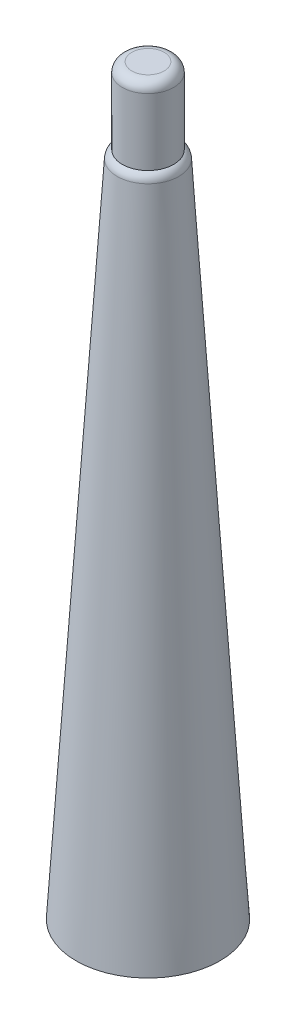
ISO-10303-21;
HEADER;
FILE_DESCRIPTION(('STEP AP214'),'2;1');
FILE_NAME('part.step','',(''),(''),'','','');
FILE_SCHEMA(('AUTOMOTIVE_DESIGN { 1 0 10303 214 1 1 1 1 }'));
ENDSEC;
DATA;
#1=APPLICATION_CONTEXT('core data for automotive mechanical design processes');
#2=APPLICATION_PROTOCOL_DEFINITION('international standard','automotive_design',2000,#1);
#3=PRODUCT_CONTEXT('',#1,'mechanical');
#4=PRODUCT('Part','Part','',(#3));
#5=PRODUCT_RELATED_PRODUCT_CATEGORY('part','',(#4));
#6=PRODUCT_DEFINITION_FORMATION('','',#4);
#7=PRODUCT_DEFINITION_CONTEXT('part definition',#1,'design');
#8=PRODUCT_DEFINITION('design','',#6,#7);
#9=PRODUCT_DEFINITION_SHAPE('','',#8);
#10=(LENGTH_UNIT() NAMED_UNIT(*) SI_UNIT(.MILLI.,.METRE.));
#11=(NAMED_UNIT(*) PLANE_ANGLE_UNIT() SI_UNIT($,.RADIAN.));
#12=(NAMED_UNIT(*) SI_UNIT($,.STERADIAN.) SOLID_ANGLE_UNIT());
#13=UNCERTAINTY_MEASURE_WITH_UNIT(LENGTH_MEASURE(1.E-05),#10,'distance_accuracy_value','');
#14=(GEOMETRIC_REPRESENTATION_CONTEXT(3) GLOBAL_UNCERTAINTY_ASSIGNED_CONTEXT((#13)) GLOBAL_UNIT_ASSIGNED_CONTEXT((#10,
#11,#12)) REPRESENTATION_CONTEXT('',''));
#15=CARTESIAN_POINT('',(0.,0.,0.));
#16=DIRECTION('',(0.,0.,1.));
#17=DIRECTION('',(1.,0.,0.));
#18=AXIS2_PLACEMENT_3D('',#15,#16,#17);
#19=CARTESIAN_POINT('',(0.,0.,0.));
#20=DIRECTION('',(0.,-1.,0.));
#21=DIRECTION('',(1.,0.,0.));
#22=AXIS2_PLACEMENT_3D('',#19,#20,#21);
#23=PLANE('',#22);
#24=CARTESIAN_POINT('',(0.,0.,0.));
#25=DIRECTION('',(0.,-1.,0.));
#26=DIRECTION('',(1.,0.,0.));
#27=AXIS2_PLACEMENT_3D('',#24,#25,#26);
#28=CIRCLE('',#27,3.5814);
#29=CARTESIAN_POINT('',(3.5814,0.,0.));
#30=VERTEX_POINT('',#29);
#31=EDGE_CURVE('E95',#30,#30,#28,.T.);
#32=ORIENTED_EDGE('',*,*,#31,.F.);
#33=EDGE_LOOP('',(#32));
#34=FACE_BOUND('',#33,.T.);
#35=CARTESIAN_POINT('',(0.,0.,0.));
#36=DIRECTION('',(0.,1.,0.));
#37=DIRECTION('',(-1.,0.,0.));
#38=AXIS2_PLACEMENT_3D('',#35,#36,#37);
#39=CIRCLE('',#38,19.177);
#40=CARTESIAN_POINT('',(-19.177,0.,0.));
#41=VERTEX_POINT('',#40);
#42=EDGE_CURVE('E79',#41,#41,#39,.T.);
#43=ORIENTED_EDGE('',*,*,#42,.F.);
#44=EDGE_LOOP('',(#43));
#45=FACE_BOUND('',#44,.T.);
#46=ADVANCED_FACE('F48',(#34,#45),#23,.T.);
#47=CARTESIAN_POINT('',(0.,177.8,0.));
#48=DIRECTION('',(0.,-1.,0.));
#49=DIRECTION('',(1.,0.,0.));
#50=AXIS2_PLACEMENT_3D('',#47,#48,#49);
#51=CONICAL_SURFACE('',#50,8.08423345153449,0.0623082542961903);
#52=CARTESIAN_POINT('',(0.,175.704143445666,0.));
#53=DIRECTION('',(0.,-1.,0.));
#54=DIRECTION('',(1.,0.,0.));
#55=AXIS2_PLACEMENT_3D('',#52,#53,#54);
#56=CIRCLE('',#55,8.21499187378587);
#57=CARTESIAN_POINT('',(8.21499187378588,175.704143445666,0.));
#58=VERTEX_POINT('',#57);
#59=EDGE_CURVE('E65',#58,#58,#56,.T.);
#60=ORIENTED_EDGE('',*,*,#59,.T.);
#61=EDGE_LOOP('',(#60));
#62=FACE_BOUND('',#61,.T.);
#63=ORIENTED_EDGE('',*,*,#42,.T.);
#64=EDGE_LOOP('',(#63));
#65=FACE_BOUND('',#64,.T.);
#66=ADVANCED_FACE('F119',(#62,#65),#51,.T.);
#67=CARTESIAN_POINT('',(0.,5.08,0.));
#68=DIRECTION('',(0.,-1.,0.));
#69=DIRECTION('',(1.,0.,0.));
#70=AXIS2_PLACEMENT_3D('',#67,#68,#69);
#71=CYLINDRICAL_SURFACE('',#70,3.5814);
#72=CARTESIAN_POINT('',(0.,5.08,0.));
#73=DIRECTION('',(0.,-1.,0.));
#74=DIRECTION('',(1.,0.,0.));
#75=AXIS2_PLACEMENT_3D('',#72,#73,#74);
#76=CIRCLE('',#75,3.5814);
#77=CARTESIAN_POINT('',(3.5814,5.08,0.));
#78=VERTEX_POINT('',#77);
#79=EDGE_CURVE('E94',#78,#78,#76,.T.);
#80=ORIENTED_EDGE('',*,*,#79,.F.);
#81=EDGE_LOOP('',(#80));
#82=FACE_BOUND('',#81,.T.);
#83=ORIENTED_EDGE('',*,*,#31,.T.);
#84=EDGE_LOOP('',(#83));
#85=FACE_BOUND('',#84,.T.);
#86=ADVANCED_FACE('F124',(#82,#85),#71,.F.);
#87=CARTESIAN_POINT('',(0.,5.08,0.));
#88=DIRECTION('',(0.,-1.,0.));
#89=DIRECTION('',(1.,0.,0.));
#90=AXIS2_PLACEMENT_3D('',#87,#88,#89);
#91=PLANE('',#90);
#92=ORIENTED_EDGE('',*,*,#79,.T.);
#93=EDGE_LOOP('',(#92));
#94=FACE_BOUND('',#93,.T.);
#95=ADVANCED_FACE('F195',(#94),#91,.T.);
#96=CARTESIAN_POINT('',(0.,198.12,0.));
#97=DIRECTION('',(0.,-1.,0.));
#98=DIRECTION('',(1.,0.,0.));
#99=AXIS2_PLACEMENT_3D('',#96,#97,#98);
#100=CYLINDRICAL_SURFACE('',#99,6.85082079884354);
#101=CARTESIAN_POINT('',(0.,195.58,0.));
#102=DIRECTION('',(0.,1.,0.));
#103=DIRECTION('',(-1.,0.,0.));
#104=AXIS2_PLACEMENT_3D('',#101,#102,#103);
#105=CIRCLE('',#104,6.85082079884354);
#106=CARTESIAN_POINT('',(-6.85082079884354,195.58,0.));
#107=VERTEX_POINT('',#106);
#108=EDGE_CURVE('E10',#107,#107,#105,.F.);
#109=ORIENTED_EDGE('',*,*,#108,.T.);
#110=EDGE_LOOP('',(#109));
#111=FACE_BOUND('',#110,.T.);
#112=CARTESIAN_POINT('',(0.,177.8,0.));
#113=DIRECTION('',(0.,1.,0.));
#114=DIRECTION('',(-1.,0.,0.));
#115=AXIS2_PLACEMENT_3D('',#112,#113,#114);
#116=CIRCLE('',#115,6.85082079884354);
#117=CARTESIAN_POINT('',(-6.85082079884354,177.8,0.));
#118=VERTEX_POINT('',#117);
#119=EDGE_CURVE('E72',#118,#118,#116,.T.);
#120=ORIENTED_EDGE('',*,*,#119,.T.);
#121=EDGE_LOOP('',(#120));
#122=FACE_BOUND('',#121,.T.);
#123=ADVANCED_FACE('F105',(#111,#122),#100,.T.);
#124=CARTESIAN_POINT('',(0.,198.12,0.));
#125=DIRECTION('',(0.,1.,0.));
#126=DIRECTION('',(-1.,0.,0.));
#127=AXIS2_PLACEMENT_3D('',#124,#125,#126);
#128=PLANE('',#127);
#129=CARTESIAN_POINT('',(0.,198.12,0.));
#130=DIRECTION('',(0.,1.,0.));
#131=DIRECTION('',(-1.,0.,0.));
#132=AXIS2_PLACEMENT_3D('',#129,#130,#131);
#133=CIRCLE('',#132,4.31082079884354);
#134=CARTESIAN_POINT('',(-4.31082079884354,198.12,0.));
#135=VERTEX_POINT('',#134);
#136=EDGE_CURVE('E57',#135,#135,#133,.T.);
#137=ORIENTED_EDGE('',*,*,#136,.T.);
#138=EDGE_LOOP('',(#137));
#139=FACE_BOUND('',#138,.T.);
#140=ADVANCED_FACE('F109',(#139),#128,.T.);
#141=CARTESIAN_POINT('',(0.,175.545982864419,0.));
#142=DIRECTION('',(0.,1.,0.));
#143=DIRECTION('',(-1.,0.,0.));
#144=AXIS2_PLACEMENT_3D('',#141,#142,#143);
#145=TOROIDAL_SURFACE('',#144,5.6799208233931,2.54);
#146=ORIENTED_EDGE('',*,*,#59,.F.);
#147=EDGE_LOOP('',(#146));
#148=FACE_BOUND('',#147,.T.);
#149=ORIENTED_EDGE('',*,*,#119,.F.);
#150=EDGE_LOOP('',(#149));
#151=FACE_BOUND('',#150,.T.);
#152=ADVANCED_FACE('F107',(#148,#151),#145,.T.);
#153=CARTESIAN_POINT('',(0.,195.58,0.));
#154=DIRECTION('',(0.,1.,0.));
#155=DIRECTION('',(-1.,0.,0.));
#156=AXIS2_PLACEMENT_3D('',#153,#154,#155);
#157=TOROIDAL_SURFACE('',#156,4.31082079884354,2.54);
#158=ORIENTED_EDGE('',*,*,#108,.F.);
#159=EDGE_LOOP('',(#158));
#160=FACE_BOUND('',#159,.T.);
#161=ORIENTED_EDGE('',*,*,#136,.F.);
#162=EDGE_LOOP('',(#161));
#163=FACE_BOUND('',#162,.T.);
#164=ADVANCED_FACE('F50',(#160,#163),#157,.T.);
#165=CLOSED_SHELL('',(#46,#66,#86,#95,#123,#140,#152,#164));
#166=CARTESIAN_POINT('',(0.,2.54,0.));
#167=DIRECTION('',(0.,-1.,0.));
#168=DIRECTION('',(1.,0.,0.));
#169=AXIS2_PLACEMENT_3D('',#166,#167,#168);
#170=PLANE('',#169);
#171=CARTESIAN_POINT('',(0.,2.54,0.));
#172=DIRECTION('',(0.,-1.,0.));
#173=DIRECTION('',(1.,0.,0.));
#174=AXIS2_PLACEMENT_3D('',#171,#172,#173);
#175=CIRCLE('',#174,6.1214);
#176=CARTESIAN_POINT('',(6.1214,2.54,0.));
#177=VERTEX_POINT('',#176);
#178=EDGE_CURVE('E83',#177,#177,#175,.T.);
#179=ORIENTED_EDGE('',*,*,#178,.T.);
#180=EDGE_LOOP('',(#179));
#181=FACE_BOUND('',#180,.T.);
#182=CARTESIAN_POINT('',(0.,2.53999999999999,0.));
#183=DIRECTION('',(0.,-1.,0.));
#184=DIRECTION('',(1.,0.,0.));
#185=AXIS2_PLACEMENT_3D('',#182,#183,#184);
#186=CIRCLE('',#185,16.4735933734652);
#187=CARTESIAN_POINT('',(16.4735933734652,2.53999999999999,0.));
#188=VERTEX_POINT('',#187);
#189=EDGE_CURVE('E75',#188,#188,#186,.F.);
#190=ORIENTED_EDGE('',*,*,#189,.T.);
#191=EDGE_LOOP('',(#190));
#192=FACE_BOUND('',#191,.T.);
#193=ADVANCED_FACE('F131',(#181,#192),#170,.F.);
#194=CARTESIAN_POINT('',(0.,177.641839418753,0.));
#195=DIRECTION('',(0.,-1.,0.));
#196=DIRECTION('',(1.,0.,0.));
#197=AXIS2_PLACEMENT_3D('',#194,#195,#196);
#198=CONICAL_SURFACE('',#197,5.54916240114172,0.0623082542961903);
#199=ORIENTED_EDGE('',*,*,#189,.F.);
#200=EDGE_LOOP('',(#199));
#201=FACE_BOUND('',#200,.T.);
#202=CARTESIAN_POINT('',(0.,175.26,0.));
#203=DIRECTION('',(0.,1.,0.));
#204=DIRECTION('',(-1.,0.,0.));
#205=AXIS2_PLACEMENT_3D('',#202,#203,#204);
#206=CIRCLE('',#205,5.69776301209872);
#207=CARTESIAN_POINT('',(-5.69776301209872,175.26,0.));
#208=VERTEX_POINT('',#207);
#209=EDGE_CURVE('E78',#208,#208,#206,.T.);
#210=ORIENTED_EDGE('',*,*,#209,.T.);
#211=EDGE_LOOP('',(#210));
#212=FACE_BOUND('',#211,.T.);
#213=ADVANCED_FACE('F134',(#201,#212),#198,.F.);
#214=CARTESIAN_POINT('',(-8.08423345153448,175.26,0.));
#215=DIRECTION('',(0.,1.,0.));
#216=DIRECTION('',(-1.,0.,0.));
#217=AXIS2_PLACEMENT_3D('',#214,#215,#216);
#218=PLANE('',#217);
#219=ORIENTED_EDGE('',*,*,#209,.F.);
#220=EDGE_LOOP('',(#219));
#221=FACE_BOUND('',#220,.T.);
#222=ADVANCED_FACE('F139',(#221),#218,.F.);
#223=CARTESIAN_POINT('',(0.,5.08,0.));
#224=DIRECTION('',(0.,-1.,0.));
#225=DIRECTION('',(1.,0.,0.));
#226=AXIS2_PLACEMENT_3D('',#223,#224,#225);
#227=CYLINDRICAL_SURFACE('',#226,6.1214);
#228=CARTESIAN_POINT('',(0.,7.62,0.));
#229=DIRECTION('',(0.,-1.,0.));
#230=DIRECTION('',(1.,0.,0.));
#231=AXIS2_PLACEMENT_3D('',#228,#229,#230);
#232=CIRCLE('',#231,6.1214);
#233=CARTESIAN_POINT('',(6.1214,7.62,0.));
#234=VERTEX_POINT('',#233);
#235=EDGE_CURVE('E87',#234,#234,#232,.T.);
#236=ORIENTED_EDGE('',*,*,#235,.T.);
#237=EDGE_LOOP('',(#236));
#238=FACE_BOUND('',#237,.T.);
#239=ORIENTED_EDGE('',*,*,#178,.F.);
#240=EDGE_LOOP('',(#239));
#241=FACE_BOUND('',#240,.T.);
#242=ADVANCED_FACE('F143',(#238,#241),#227,.T.);
#243=CARTESIAN_POINT('',(0.,7.62,0.));
#244=DIRECTION('',(0.,-1.,0.));
#245=DIRECTION('',(1.,0.,0.));
#246=AXIS2_PLACEMENT_3D('',#243,#244,#245);
#247=PLANE('',#246);
#248=ORIENTED_EDGE('',*,*,#235,.F.);
#249=EDGE_LOOP('',(#248));
#250=FACE_BOUND('',#249,.T.);
#251=ADVANCED_FACE('F146',(#250),#247,.F.);
#252=CLOSED_SHELL('',(#193,#213,#222,#242,#251));
#253=ORIENTED_CLOSED_SHELL('',*,#252,.T.);
#254=BREP_WITH_VOIDS('B2',#165,(#253));
#255=ADVANCED_BREP_SHAPE_REPRESENTATION('',(#18,#254),#14);
#256=SHAPE_DEFINITION_REPRESENTATION(#9,#255);
ENDSEC;
END-ISO-10303-21;
